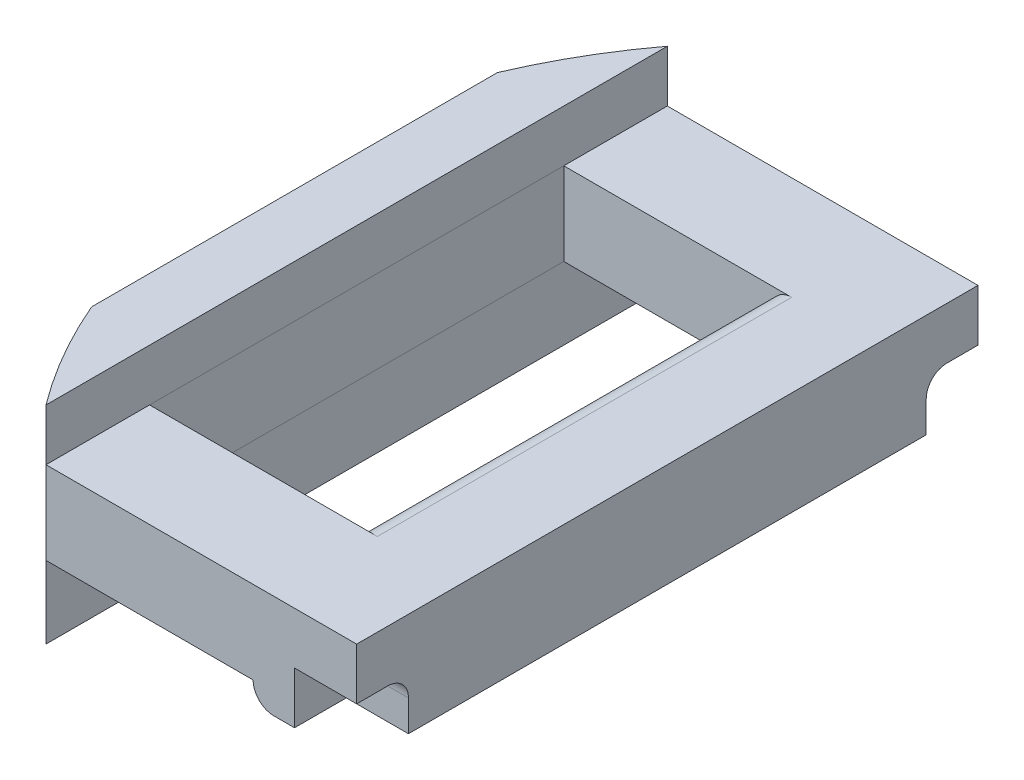
ISO-10303-21;
HEADER;
FILE_DESCRIPTION(('STEP AP214'),'2;1');
FILE_NAME('part.step','',(''),(''),'','','');
FILE_SCHEMA(('AUTOMOTIVE_DESIGN { 1 0 10303 214 1 1 1 1 }'));
ENDSEC;
DATA;
#1=APPLICATION_CONTEXT('core data for automotive mechanical design processes');
#2=APPLICATION_PROTOCOL_DEFINITION('international standard','automotive_design',2000,#1);
#3=PRODUCT_CONTEXT('',#1,'mechanical');
#4=PRODUCT('Part','Part','',(#3));
#5=PRODUCT_RELATED_PRODUCT_CATEGORY('part','',(#4));
#6=PRODUCT_DEFINITION_FORMATION('','',#4);
#7=PRODUCT_DEFINITION_CONTEXT('part definition',#1,'design');
#8=PRODUCT_DEFINITION('design','',#6,#7);
#9=PRODUCT_DEFINITION_SHAPE('','',#8);
#10=(LENGTH_UNIT() NAMED_UNIT(*) SI_UNIT(.MILLI.,.METRE.));
#11=(NAMED_UNIT(*) PLANE_ANGLE_UNIT() SI_UNIT($,.RADIAN.));
#12=(NAMED_UNIT(*) SI_UNIT($,.STERADIAN.) SOLID_ANGLE_UNIT());
#13=UNCERTAINTY_MEASURE_WITH_UNIT(LENGTH_MEASURE(1.E-05),#10,'distance_accuracy_value','');
#14=(GEOMETRIC_REPRESENTATION_CONTEXT(3) GLOBAL_UNCERTAINTY_ASSIGNED_CONTEXT((#13)) GLOBAL_UNIT_ASSIGNED_CONTEXT((#10,
#11,#12)) REPRESENTATION_CONTEXT('',''));
#15=CARTESIAN_POINT('',(0.,0.,0.));
#16=DIRECTION('',(0.,0.,1.));
#17=DIRECTION('',(1.,0.,0.));
#18=AXIS2_PLACEMENT_3D('',#15,#16,#17);
#19=CARTESIAN_POINT('',(10.,0.,15.));
#20=DIRECTION('',(1.,0.,0.));
#21=DIRECTION('',(0.,1.,0.));
#22=AXIS2_PLACEMENT_3D('',#19,#20,#21);
#23=PLANE('',#22);
#24=DIRECTION('',(0.,0.,-1.));
#25=VECTOR('',#24,1.);
#26=CARTESIAN_POINT('',(10.,2.5,1.25));
#27=LINE('',#26,#25);
#28=CARTESIAN_POINT('',(10.,2.5,-13.5));
#29=VERTEX_POINT('',#28);
#30=CARTESIAN_POINT('',(10.,2.5,-15.));
#31=VERTEX_POINT('',#30);
#32=EDGE_CURVE('E230',#29,#31,#27,.T.);
#33=ORIENTED_EDGE('',*,*,#32,.T.);
#34=DIRECTION('',(0.,1.,0.));
#35=VECTOR('',#34,1.);
#36=CARTESIAN_POINT('',(10.,0.,-15.));
#37=LINE('',#36,#35);
#38=CARTESIAN_POINT('',(10.,5.,-15.));
#39=VERTEX_POINT('',#38);
#40=EDGE_CURVE('E368',#31,#39,#37,.T.);
#41=ORIENTED_EDGE('',*,*,#40,.T.);
#42=DIRECTION('',(0.,0.,-1.));
#43=VECTOR('',#42,1.);
#44=CARTESIAN_POINT('',(10.,5.,15.));
#45=LINE('',#44,#43);
#46=CARTESIAN_POINT('',(10.,5.,15.));
#47=VERTEX_POINT('',#46);
#48=EDGE_CURVE('E266',#47,#39,#45,.T.);
#49=ORIENTED_EDGE('',*,*,#48,.F.);
#50=DIRECTION('',(0.,1.,0.));
#51=VECTOR('',#50,1.);
#52=CARTESIAN_POINT('',(10.,0.,15.));
#53=LINE('',#52,#51);
#54=CARTESIAN_POINT('',(10.,2.5,15.));
#55=VERTEX_POINT('',#54);
#56=EDGE_CURVE('E11',#55,#47,#53,.T.);
#57=ORIENTED_EDGE('',*,*,#56,.F.);
#58=DIRECTION('',(0.,0.,-1.));
#59=VECTOR('',#58,1.);
#60=CARTESIAN_POINT('',(10.,2.5,15.));
#61=LINE('',#60,#59);
#62=CARTESIAN_POINT('',(10.,2.5,13.5));
#63=VERTEX_POINT('',#62);
#64=EDGE_CURVE('E193',#55,#63,#61,.T.);
#65=ORIENTED_EDGE('',*,*,#64,.T.);
#66=CARTESIAN_POINT('',(10.,1.5,13.5));
#67=DIRECTION('',(1.,0.,0.));
#68=DIRECTION('',(0.,0.707106781186547,-0.707106781186548));
#69=AXIS2_PLACEMENT_3D('',#66,#67,#68);
#70=CIRCLE('',#69,1.);
#71=CARTESIAN_POINT('',(10.,1.5,12.5));
#72=VERTEX_POINT('',#71);
#73=EDGE_CURVE('E219',#72,#63,#70,.T.);
#74=ORIENTED_EDGE('',*,*,#73,.F.);
#75=DIRECTION('',(0.,-1.,0.));
#76=VECTOR('',#75,1.);
#77=CARTESIAN_POINT('',(10.,1.25,12.5));
#78=LINE('',#77,#76);
#79=CARTESIAN_POINT('',(10.,0.,12.5));
#80=VERTEX_POINT('',#79);
#81=EDGE_CURVE('E30',#72,#80,#78,.T.);
#82=ORIENTED_EDGE('',*,*,#81,.T.);
#83=DIRECTION('',(0.,0.,-1.));
#84=VECTOR('',#83,1.);
#85=CARTESIAN_POINT('',(10.,0.,15.));
#86=LINE('',#85,#84);
#87=CARTESIAN_POINT('',(10.,0.,-12.5));
#88=VERTEX_POINT('',#87);
#89=EDGE_CURVE('E393',#80,#88,#86,.T.);
#90=ORIENTED_EDGE('',*,*,#89,.T.);
#91=DIRECTION('',(0.,1.,0.));
#92=VECTOR('',#91,1.);
#93=CARTESIAN_POINT('',(10.,0.,-12.5));
#94=LINE('',#93,#92);
#95=CARTESIAN_POINT('',(10.,1.5,-12.5));
#96=VERTEX_POINT('',#95);
#97=EDGE_CURVE('E238',#88,#96,#94,.T.);
#98=ORIENTED_EDGE('',*,*,#97,.T.);
#99=CARTESIAN_POINT('',(10.,1.5,-13.5));
#100=DIRECTION('',(1.,0.,0.));
#101=DIRECTION('',(0.,0.707106781186547,0.707106781186548));
#102=AXIS2_PLACEMENT_3D('',#99,#100,#101);
#103=CIRCLE('',#102,1.);
#104=EDGE_CURVE('E237',#29,#96,#103,.T.);
#105=ORIENTED_EDGE('',*,*,#104,.F.);
#106=EDGE_LOOP('',(#33,#41,#49,#57,#65,#74,#82,#90,#98,#105));
#107=FACE_BOUND('',#106,.T.);
#108=ADVANCED_FACE('F16',(#107),#23,.T.);
#109=CARTESIAN_POINT('',(-10.,0.,15.));
#110=DIRECTION('',(0.,0.,1.));
#111=DIRECTION('',(1.,0.,0.));
#112=AXIS2_PLACEMENT_3D('',#109,#110,#111);
#113=PLANE('',#112);
#114=CARTESIAN_POINT('',(6.,1.,15.));
#115=DIRECTION('',(0.,0.,-1.));
#116=DIRECTION('',(-0.707106781186547,-0.707106781186548,0.));
#117=AXIS2_PLACEMENT_3D('',#114,#115,#116);
#118=CIRCLE('',#117,1.);
#119=CARTESIAN_POINT('',(6.,0.,15.));
#120=VERTEX_POINT('',#119);
#121=CARTESIAN_POINT('',(5.,1.,15.));
#122=VERTEX_POINT('',#121);
#123=EDGE_CURVE('E333',#120,#122,#118,.T.);
#124=ORIENTED_EDGE('',*,*,#123,.F.);
#125=DIRECTION('',(1.,0.,0.));
#126=VECTOR('',#125,1.);
#127=CARTESIAN_POINT('',(-10.,0.,15.));
#128=LINE('',#127,#126);
#129=CARTESIAN_POINT('',(7.,0.,15.));
#130=VERTEX_POINT('',#129);
#131=EDGE_CURVE('E203',#120,#130,#128,.T.);
#132=ORIENTED_EDGE('',*,*,#131,.T.);
#133=DIRECTION('',(0.,1.,0.));
#134=VECTOR('',#133,1.);
#135=CARTESIAN_POINT('',(7.,0.625,15.));
#136=LINE('',#135,#134);
#137=CARTESIAN_POINT('',(7.,2.5,15.));
#138=VERTEX_POINT('',#137);
#139=EDGE_CURVE('E196',#130,#138,#136,.T.);
#140=ORIENTED_EDGE('',*,*,#139,.T.);
#141=DIRECTION('',(1.,0.,0.));
#142=VECTOR('',#141,1.);
#143=CARTESIAN_POINT('',(0.,2.5,15.));
#144=LINE('',#143,#142);
#145=EDGE_CURVE('E186',#138,#55,#144,.T.);
#146=ORIENTED_EDGE('',*,*,#145,.T.);
#147=ORIENTED_EDGE('',*,*,#56,.T.);
#148=DIRECTION('',(1.,0.,0.));
#149=VECTOR('',#148,1.);
#150=CARTESIAN_POINT('',(-10.,5.,15.));
#151=LINE('',#150,#149);
#152=CARTESIAN_POINT('',(-5.00000024214387,5.,15.));
#153=VERTEX_POINT('',#152);
#154=EDGE_CURVE('E265',#153,#47,#151,.T.);
#155=ORIENTED_EDGE('',*,*,#154,.F.);
#156=DIRECTION('',(0.,-1.,0.));
#157=VECTOR('',#156,1.);
#158=CARTESIAN_POINT('',(-5.00000024214387,1.,15.));
#159=LINE('',#158,#157);
#160=CARTESIAN_POINT('',(-5.00000007450581,1.,15.0000002235174));
#161=VERTEX_POINT('',#160);
#162=EDGE_CURVE('E295',#153,#161,#159,.T.);
#163=ORIENTED_EDGE('',*,*,#162,.T.);
#164=DIRECTION('',(1.,0.,0.));
#165=VECTOR('',#164,1.);
#166=CARTESIAN_POINT('',(-6.25,1.,15.));
#167=LINE('',#166,#165);
#168=EDGE_CURVE('E162',#161,#122,#167,.T.);
#169=ORIENTED_EDGE('',*,*,#168,.T.);
#170=EDGE_LOOP('',(#124,#132,#140,#146,#147,#155,#163,#169));
#171=FACE_BOUND('',#170,.T.);
#172=ADVANCED_FACE('F199',(#171),#113,.T.);
#173=CARTESIAN_POINT('',(10.,2.5,12.5));
#174=DIRECTION('',(0.,0.,-1.));
#175=DIRECTION('',(0.,-1.,0.));
#176=AXIS2_PLACEMENT_3D('',#173,#174,#175);
#177=PLANE('',#176);
#178=DIRECTION('',(1.,0.,0.));
#179=VECTOR('',#178,1.);
#180=CARTESIAN_POINT('',(10.,1.5,12.5));
#181=LINE('',#180,#179);
#182=CARTESIAN_POINT('',(7.,1.5,12.5));
#183=VERTEX_POINT('',#182);
#184=EDGE_CURVE('E269',#183,#72,#181,.T.);
#185=ORIENTED_EDGE('',*,*,#184,.F.);
#186=DIRECTION('',(0.,-1.,0.));
#187=VECTOR('',#186,1.);
#188=CARTESIAN_POINT('',(7.,2.5,12.5));
#189=LINE('',#188,#187);
#190=CARTESIAN_POINT('',(7.,0.,12.5));
#191=VERTEX_POINT('',#190);
#192=EDGE_CURVE('E206',#183,#191,#189,.T.);
#193=ORIENTED_EDGE('',*,*,#192,.T.);
#194=DIRECTION('',(-1.,0.,0.));
#195=VECTOR('',#194,1.);
#196=CARTESIAN_POINT('',(5.,0.,12.5));
#197=LINE('',#196,#195);
#198=EDGE_CURVE('E345',#80,#191,#197,.T.);
#199=ORIENTED_EDGE('',*,*,#198,.F.);
#200=ORIENTED_EDGE('',*,*,#81,.F.);
#201=EDGE_LOOP('',(#185,#193,#199,#200));
#202=FACE_BOUND('',#201,.T.);
#203=ADVANCED_FACE('F610',(#202),#177,.F.);
#204=CARTESIAN_POINT('',(7.,1.25,-13.75));
#205=DIRECTION('',(-1.,0.,0.));
#206=DIRECTION('',(0.,0.,1.));
#207=AXIS2_PLACEMENT_3D('',#204,#205,#206);
#208=PLANE('',#207);
#209=CARTESIAN_POINT('',(7.,1.5,-13.5));
#210=DIRECTION('',(1.,0.,0.));
#211=DIRECTION('',(0.,0.707106781186547,0.707106781186548));
#212=AXIS2_PLACEMENT_3D('',#209,#210,#211);
#213=CIRCLE('',#212,1.);
#214=CARTESIAN_POINT('',(7.,2.5,-13.5));
#215=VERTEX_POINT('',#214);
#216=CARTESIAN_POINT('',(7.,1.5,-12.5));
#217=VERTEX_POINT('',#216);
#218=EDGE_CURVE('E350',#215,#217,#213,.T.);
#219=ORIENTED_EDGE('',*,*,#218,.T.);
#220=DIRECTION('',(0.,1.,0.));
#221=VECTOR('',#220,1.);
#222=CARTESIAN_POINT('',(7.,2.5,-12.5));
#223=LINE('',#222,#221);
#224=CARTESIAN_POINT('',(7.,0.,-12.5));
#225=VERTEX_POINT('',#224);
#226=EDGE_CURVE('E359',#225,#217,#223,.T.);
#227=ORIENTED_EDGE('',*,*,#226,.F.);
#228=DIRECTION('',(0.,0.,1.));
#229=VECTOR('',#228,1.);
#230=CARTESIAN_POINT('',(7.,0.,-6.875));
#231=LINE('',#230,#229);
#232=CARTESIAN_POINT('',(7.,0.,-15.));
#233=VERTEX_POINT('',#232);
#234=EDGE_CURVE('E388',#233,#225,#231,.T.);
#235=ORIENTED_EDGE('',*,*,#234,.F.);
#236=DIRECTION('',(0.,-1.,0.));
#237=VECTOR('',#236,1.);
#238=CARTESIAN_POINT('',(7.,0.625,-15.));
#239=LINE('',#238,#237);
#240=CARTESIAN_POINT('',(7.,2.5,-15.));
#241=VERTEX_POINT('',#240);
#242=EDGE_CURVE('E271',#241,#233,#239,.T.);
#243=ORIENTED_EDGE('',*,*,#242,.F.);
#244=DIRECTION('',(0.,0.,-1.));
#245=VECTOR('',#244,1.);
#246=CARTESIAN_POINT('',(7.,2.5,-15.));
#247=LINE('',#246,#245);
#248=EDGE_CURVE('E233',#215,#241,#247,.T.);
#249=ORIENTED_EDGE('',*,*,#248,.F.);
#250=EDGE_LOOP('',(#219,#227,#235,#243,#249));
#251=FACE_BOUND('',#250,.T.);
#252=ADVANCED_FACE('F600',(#251),#208,.F.);
#253=CARTESIAN_POINT('',(10.,2.5,-12.5));
#254=DIRECTION('',(0.,1.,0.));
#255=DIRECTION('',(1.,0.,0.));
#256=AXIS2_PLACEMENT_3D('',#253,#254,#255);
#257=PLANE('',#256);
#258=DIRECTION('',(1.,0.,0.));
#259=VECTOR('',#258,1.);
#260=CARTESIAN_POINT('',(10.,2.5,-13.5));
#261=LINE('',#260,#259);
#262=EDGE_CURVE('E253',#215,#29,#261,.T.);
#263=ORIENTED_EDGE('',*,*,#262,.F.);
#264=ORIENTED_EDGE('',*,*,#248,.T.);
#265=DIRECTION('',(-1.,0.,0.));
#266=VECTOR('',#265,1.);
#267=CARTESIAN_POINT('',(10.,2.5,-15.));
#268=LINE('',#267,#266);
#269=EDGE_CURVE('E283',#31,#241,#268,.T.);
#270=ORIENTED_EDGE('',*,*,#269,.F.);
#271=ORIENTED_EDGE('',*,*,#32,.F.);
#272=EDGE_LOOP('',(#263,#264,#270,#271));
#273=FACE_BOUND('',#272,.T.);
#274=ADVANCED_FACE('F595',(#273),#257,.F.);
#275=CARTESIAN_POINT('',(-10.,0.,-10.));
#276=DIRECTION('',(0.,0.,1.));
#277=DIRECTION('',(1.,0.,0.));
#278=AXIS2_PLACEMENT_3D('',#275,#276,#277);
#279=PLANE('',#278);
#280=DIRECTION('',(0.,-1.,0.));
#281=VECTOR('',#280,1.);
#282=CARTESIAN_POINT('',(-4.99999982615312,0.5,-10.));
#283=LINE('',#282,#281);
#284=CARTESIAN_POINT('',(-4.99999982615312,5.,-10.));
#285=VERTEX_POINT('',#284);
#286=CARTESIAN_POINT('',(-4.99999982615312,1.,-10.));
#287=VERTEX_POINT('',#286);
#288=EDGE_CURVE('E320',#285,#287,#283,.T.);
#289=ORIENTED_EDGE('',*,*,#288,.T.);
#290=DIRECTION('',(1.,0.,0.));
#291=VECTOR('',#290,1.);
#292=CARTESIAN_POINT('',(-6.25,1.,-10.));
#293=LINE('',#292,#291);
#294=CARTESIAN_POINT('',(5.,1.,-10.));
#295=VERTEX_POINT('',#294);
#296=EDGE_CURVE('E311',#287,#295,#293,.T.);
#297=ORIENTED_EDGE('',*,*,#296,.T.);
#298=DIRECTION('',(0.,1.,0.));
#299=VECTOR('',#298,1.);
#300=CARTESIAN_POINT('',(5.,0.,-10.));
#301=LINE('',#300,#299);
#302=CARTESIAN_POINT('',(5.,4.,-10.));
#303=VERTEX_POINT('',#302);
#304=EDGE_CURVE('E228',#295,#303,#301,.T.);
#305=ORIENTED_EDGE('',*,*,#304,.T.);
#306=CARTESIAN_POINT('',(6.,4.,-10.));
#307=DIRECTION('',(0.,0.,1.));
#308=DIRECTION('',(-0.707106781186547,0.707106781186548,0.));
#309=AXIS2_PLACEMENT_3D('',#306,#307,#308);
#310=CIRCLE('',#309,1.);
#311=CARTESIAN_POINT('',(6.,5.,-10.));
#312=VERTEX_POINT('',#311);
#313=EDGE_CURVE('E323',#312,#303,#310,.T.);
#314=ORIENTED_EDGE('',*,*,#313,.F.);
#315=DIRECTION('',(1.,0.,0.));
#316=VECTOR('',#315,1.);
#317=CARTESIAN_POINT('',(5.,5.,-10.));
#318=LINE('',#317,#316);
#319=EDGE_CURVE('E254',#285,#312,#318,.T.);
#320=ORIENTED_EDGE('',*,*,#319,.F.);
#321=EDGE_LOOP('',(#289,#297,#305,#314,#320));
#322=FACE_BOUND('',#321,.T.);
#323=ADVANCED_FACE('F495',(#322),#279,.T.);
#324=CARTESIAN_POINT('',(5.,0.,10.));
#325=DIRECTION('',(0.,0.,-1.));
#326=DIRECTION('',(0.,-1.,0.));
#327=AXIS2_PLACEMENT_3D('',#324,#325,#326);
#328=PLANE('',#327);
#329=DIRECTION('',(0.,1.,0.));
#330=VECTOR('',#329,1.);
#331=CARTESIAN_POINT('',(-5.00000002483527,0.5,10.));
#332=LINE('',#331,#330);
#333=CARTESIAN_POINT('',(-5.00000007450581,1.,10.0000001490116));
#334=VERTEX_POINT('',#333);
#335=CARTESIAN_POINT('',(-5.00000007450581,5.,10.0000001490116));
#336=VERTEX_POINT('',#335);
#337=EDGE_CURVE('E41',#334,#336,#332,.T.);
#338=ORIENTED_EDGE('',*,*,#337,.T.);
#339=DIRECTION('',(-1.,0.,0.));
#340=VECTOR('',#339,1.);
#341=CARTESIAN_POINT('',(-10.,5.,10.));
#342=LINE('',#341,#340);
#343=CARTESIAN_POINT('',(6.,5.,10.));
#344=VERTEX_POINT('',#343);
#345=EDGE_CURVE('E270',#344,#336,#342,.T.);
#346=ORIENTED_EDGE('',*,*,#345,.F.);
#347=CARTESIAN_POINT('',(6.,4.,10.));
#348=DIRECTION('',(0.,0.,-1.));
#349=DIRECTION('',(-0.707106781186547,0.707106781186548,0.));
#350=AXIS2_PLACEMENT_3D('',#347,#348,#349);
#351=CIRCLE('',#350,1.);
#352=CARTESIAN_POINT('',(5.,4.,10.));
#353=VERTEX_POINT('',#352);
#354=EDGE_CURVE('E307',#353,#344,#351,.T.);
#355=ORIENTED_EDGE('',*,*,#354,.F.);
#356=DIRECTION('',(0.,1.,0.));
#357=VECTOR('',#356,1.);
#358=CARTESIAN_POINT('',(5.,0.,10.));
#359=LINE('',#358,#357);
#360=CARTESIAN_POINT('',(5.,1.,10.));
#361=VERTEX_POINT('',#360);
#362=EDGE_CURVE('E229',#361,#353,#359,.T.);
#363=ORIENTED_EDGE('',*,*,#362,.F.);
#364=DIRECTION('',(-1.,0.,0.));
#365=VECTOR('',#364,1.);
#366=CARTESIAN_POINT('',(1.25,1.,10.));
#367=LINE('',#366,#365);
#368=EDGE_CURVE('E396',#361,#334,#367,.T.);
#369=ORIENTED_EDGE('',*,*,#368,.T.);
#370=EDGE_LOOP('',(#338,#346,#355,#363,#369));
#371=FACE_BOUND('',#370,.T.);
#372=ADVANCED_FACE('F579',(#371),#328,.T.);
#373=CARTESIAN_POINT('',(15.0000002235174,1.,0.));
#374=DIRECTION('',(0.,1.,0.));
#375=DIRECTION('',(-0.8,0.,0.6));
#376=AXIS2_PLACEMENT_3D('',#373,#374,#375);
#377=CYLINDRICAL_SURFACE('',#376,25.000000372529);
#378=DIRECTION('',(0.,1.,0.));
#379=VECTOR('',#378,1.);
#380=CARTESIAN_POINT('',(-7.9999998882413,1.,-9.79795965931432));
#381=LINE('',#380,#379);
#382=CARTESIAN_POINT('',(-7.9999998882413,-2.5,-9.79795965931434));
#383=VERTEX_POINT('',#382);
#384=CARTESIAN_POINT('',(-7.99999988824129,7.5,-9.79795965931434));
#385=VERTEX_POINT('',#384);
#386=EDGE_CURVE('E252',#383,#385,#381,.T.);
#387=ORIENTED_EDGE('',*,*,#386,.T.);
#388=CARTESIAN_POINT('',(15.0000002235174,7.5,0.));
#389=DIRECTION('',(0.,1.,0.));
#390=DIRECTION('',(-0.8,0.,-0.6));
#391=AXIS2_PLACEMENT_3D('',#388,#389,#390);
#392=CIRCLE('',#391,25.000000372529);
#393=CARTESIAN_POINT('',(-5.00000007450581,7.5,-15.0000002235174));
#394=VERTEX_POINT('',#393);
#395=EDGE_CURVE('E285',#394,#385,#392,.T.);
#396=ORIENTED_EDGE('',*,*,#395,.F.);
#397=DIRECTION('',(0.,1.,0.));
#398=VECTOR('',#397,1.);
#399=CARTESIAN_POINT('',(-5.00000007450581,5.,-15.0000002235174));
#400=LINE('',#399,#398);
#401=CARTESIAN_POINT('',(-5.00000007450581,5.,-15.0000002235174));
#402=VERTEX_POINT('',#401);
#403=EDGE_CURVE('E387',#402,#394,#400,.T.);
#404=ORIENTED_EDGE('',*,*,#403,.F.);
#405=DIRECTION('',(0.,1.,0.));
#406=VECTOR('',#405,1.);
#407=CARTESIAN_POINT('',(-4.99999977648258,1.,-15.));
#408=LINE('',#407,#406);
#409=CARTESIAN_POINT('',(-5.00000007450581,1.,-15.0000002235174));
#410=VERTEX_POINT('',#409);
#411=EDGE_CURVE('E258',#410,#402,#408,.T.);
#412=ORIENTED_EDGE('',*,*,#411,.F.);
#413=DIRECTION('',(0.,-1.,0.));
#414=VECTOR('',#413,1.);
#415=CARTESIAN_POINT('',(-5.00000007450581,0.,-15.0000002235174));
#416=LINE('',#415,#414);
#417=CARTESIAN_POINT('',(-5.00000007450581,-2.5,-15.0000002235174));
#418=VERTEX_POINT('',#417);
#419=EDGE_CURVE('E294',#410,#418,#416,.T.);
#420=ORIENTED_EDGE('',*,*,#419,.T.);
#421=CARTESIAN_POINT('',(15.0000002235174,-2.5,0.));
#422=DIRECTION('',(0.,-1.,0.));
#423=DIRECTION('',(-0.91999999076128,0.,-0.391918380532534));
#424=AXIS2_PLACEMENT_3D('',#421,#422,#423);
#425=CIRCLE('',#424,25.000000372529);
#426=EDGE_CURVE('E301',#383,#418,#425,.T.);
#427=ORIENTED_EDGE('',*,*,#426,.F.);
#428=EDGE_LOOP('',(#387,#396,#404,#412,#420,#427));
#429=FACE_BOUND('',#428,.T.);
#430=ADVANCED_FACE('F584',(#429),#377,.T.);
#431=CARTESIAN_POINT('',(-5.00000002483527,1.,10.0000001490116));
#432=DIRECTION('',(1.,0.,9.93410749217105E-09));
#433=DIRECTION('',(0.,-1.,0.));
#434=AXIS2_PLACEMENT_3D('',#431,#432,#433);
#435=PLANE('',#434);
#436=DIRECTION('',(9.93410749217105E-09,0.,-1.));
#437=VECTOR('',#436,1.);
#438=CARTESIAN_POINT('',(-5.00000007450581,1.,15.0000002235174));
#439=LINE('',#438,#437);
#440=EDGE_CURVE('E277',#334,#287,#439,.T.);
#441=ORIENTED_EDGE('',*,*,#440,.T.);
#442=ORIENTED_EDGE('',*,*,#288,.F.);
#443=DIRECTION('',(9.93410749217105E-09,0.,-1.));
#444=VECTOR('',#443,1.);
#445=CARTESIAN_POINT('',(-5.00000007450581,5.,15.0000002235174));
#446=LINE('',#445,#444);
#447=EDGE_CURVE('E243',#336,#285,#446,.T.);
#448=ORIENTED_EDGE('',*,*,#447,.F.);
#449=ORIENTED_EDGE('',*,*,#337,.F.);
#450=EDGE_LOOP('',(#441,#442,#448,#449));
#451=FACE_BOUND('',#450,.T.);
#452=ADVANCED_FACE('F655',(#451),#435,.T.);
#453=CARTESIAN_POINT('',(-2.5,1.,12.5));
#454=DIRECTION('',(0.,1.,0.));
#455=DIRECTION('',(1.,0.,0.));
#456=AXIS2_PLACEMENT_3D('',#453,#454,#455);
#457=PLANE('',#456);
#458=DIRECTION('',(0.,0.,-1.));
#459=VECTOR('',#458,1.);
#460=CARTESIAN_POINT('',(-5.00000007450581,1.,13.7500001117587));
#461=LINE('',#460,#459);
#462=EDGE_CURVE('E278',#287,#410,#461,.T.);
#463=ORIENTED_EDGE('',*,*,#462,.T.);
#464=DIRECTION('',(-1.,0.,0.));
#465=VECTOR('',#464,1.);
#466=CARTESIAN_POINT('',(3.75,1.,-15.));
#467=LINE('',#466,#465);
#468=CARTESIAN_POINT('',(5.,1.,-15.));
#469=VERTEX_POINT('',#468);
#470=EDGE_CURVE('E261',#469,#410,#467,.T.);
#471=ORIENTED_EDGE('',*,*,#470,.F.);
#472=DIRECTION('',(0.,0.,-1.));
#473=VECTOR('',#472,1.);
#474=CARTESIAN_POINT('',(5.,1.,-10.));
#475=LINE('',#474,#473);
#476=EDGE_CURVE('E331',#295,#469,#475,.T.);
#477=ORIENTED_EDGE('',*,*,#476,.F.);
#478=ORIENTED_EDGE('',*,*,#296,.F.);
#479=EDGE_LOOP('',(#463,#471,#477,#478));
#480=FACE_BOUND('',#479,.T.);
#481=ADVANCED_FACE('F660',(#480),#457,.F.);
#482=CARTESIAN_POINT('',(-2.5,1.,12.5));
#483=DIRECTION('',(0.,1.,0.));
#484=DIRECTION('',(1.,0.,0.));
#485=AXIS2_PLACEMENT_3D('',#482,#483,#484);
#486=PLANE('',#485);
#487=DIRECTION('',(0.,0.,-1.));
#488=VECTOR('',#487,1.);
#489=CARTESIAN_POINT('',(-5.00000007450581,1.,13.7500001117587));
#490=LINE('',#489,#488);
#491=EDGE_CURVE('E276',#161,#334,#490,.T.);
#492=ORIENTED_EDGE('',*,*,#491,.T.);
#493=ORIENTED_EDGE('',*,*,#368,.F.);
#494=DIRECTION('',(0.,0.,-1.));
#495=VECTOR('',#494,1.);
#496=CARTESIAN_POINT('',(5.,1.,15.));
#497=LINE('',#496,#495);
#498=EDGE_CURVE('E329',#122,#361,#497,.T.);
#499=ORIENTED_EDGE('',*,*,#498,.F.);
#500=ORIENTED_EDGE('',*,*,#168,.F.);
#501=EDGE_LOOP('',(#492,#493,#499,#500));
#502=FACE_BOUND('',#501,.T.);
#503=ADVANCED_FACE('F730',(#502),#486,.F.);
#504=CARTESIAN_POINT('',(-5.00000007450581,0.,15.0000002235174));
#505=DIRECTION('',(1.,0.,0.));
#506=DIRECTION('',(0.,1.,0.));
#507=AXIS2_PLACEMENT_3D('',#504,#505,#506);
#508=PLANE('',#507);
#509=ORIENTED_EDGE('',*,*,#419,.F.);
#510=ORIENTED_EDGE('',*,*,#462,.F.);
#511=ORIENTED_EDGE('',*,*,#440,.F.);
#512=ORIENTED_EDGE('',*,*,#491,.F.);
#513=DIRECTION('',(0.,1.,0.));
#514=VECTOR('',#513,1.);
#515=CARTESIAN_POINT('',(-5.00000007450581,0.,15.0000002235174));
#516=LINE('',#515,#514);
#517=CARTESIAN_POINT('',(-5.00000007450581,-2.5,15.0000002235174));
#518=VERTEX_POINT('',#517);
#519=EDGE_CURVE('E20',#518,#161,#516,.T.);
#520=ORIENTED_EDGE('',*,*,#519,.F.);
#521=DIRECTION('',(0.,0.,1.));
#522=VECTOR('',#521,1.);
#523=CARTESIAN_POINT('',(-5.00000007450581,-2.5,-15.0000002235174));
#524=LINE('',#523,#522);
#525=EDGE_CURVE('E304',#418,#518,#524,.T.);
#526=ORIENTED_EDGE('',*,*,#525,.F.);
#527=EDGE_LOOP('',(#509,#510,#511,#512,#520,#526));
#528=FACE_BOUND('',#527,.T.);
#529=ADVANCED_FACE('F18',(#528),#508,.T.);
#530=CARTESIAN_POINT('',(15.0000002235174,1.,0.));
#531=DIRECTION('',(0.,1.,0.));
#532=DIRECTION('',(-0.8,0.,0.6));
#533=AXIS2_PLACEMENT_3D('',#530,#531,#532);
#534=CYLINDRICAL_SURFACE('',#533,25.000000372529);
#535=DIRECTION('',(0.,-1.,0.));
#536=VECTOR('',#535,1.);
#537=CARTESIAN_POINT('',(-7.99999988824129,1.,9.79795965931433));
#538=LINE('',#537,#536);
#539=CARTESIAN_POINT('',(-7.99999988824129,7.5,9.79795965931435));
#540=VERTEX_POINT('',#539);
#541=CARTESIAN_POINT('',(-7.99999988824129,-2.5,9.79795965931434));
#542=VERTEX_POINT('',#541);
#543=EDGE_CURVE('E194',#540,#542,#538,.T.);
#544=ORIENTED_EDGE('',*,*,#543,.T.);
#545=CARTESIAN_POINT('',(15.0000002235174,-2.5,0.));
#546=DIRECTION('',(0.,-1.,0.));
#547=DIRECTION('',(-0.8,0.,0.6));
#548=AXIS2_PLACEMENT_3D('',#545,#546,#547);
#549=CIRCLE('',#548,25.000000372529);
#550=EDGE_CURVE('E374',#518,#542,#549,.T.);
#551=ORIENTED_EDGE('',*,*,#550,.F.);
#552=ORIENTED_EDGE('',*,*,#519,.T.);
#553=ORIENTED_EDGE('',*,*,#162,.F.);
#554=DIRECTION('',(0.,1.,0.));
#555=VECTOR('',#554,1.);
#556=CARTESIAN_POINT('',(-5.00000024214387,5.,15.));
#557=LINE('',#556,#555);
#558=CARTESIAN_POINT('',(-5.00000024214387,7.5,15.));
#559=VERTEX_POINT('',#558);
#560=EDGE_CURVE('E289',#153,#559,#557,.T.);
#561=ORIENTED_EDGE('',*,*,#560,.T.);
#562=CARTESIAN_POINT('',(15.0000002235174,7.5,0.));
#563=DIRECTION('',(0.,1.,0.));
#564=DIRECTION('',(-0.91999999076128,0.,0.391918380532535));
#565=AXIS2_PLACEMENT_3D('',#562,#563,#564);
#566=CIRCLE('',#565,25.000000372529);
#567=EDGE_CURVE('E377',#540,#559,#566,.T.);
#568=ORIENTED_EDGE('',*,*,#567,.F.);
#569=EDGE_LOOP('',(#544,#551,#552,#553,#561,#568));
#570=FACE_BOUND('',#569,.T.);
#571=ADVANCED_FACE('F431',(#570),#534,.T.);
#572=CARTESIAN_POINT('',(0.,5.,0.));
#573=DIRECTION('',(0.,1.,0.));
#574=DIRECTION('',(1.,0.,0.));
#575=AXIS2_PLACEMENT_3D('',#572,#573,#574);
#576=PLANE('',#575);
#577=DIRECTION('',(-5.58793533204464E-09,0.,1.));
#578=VECTOR('',#577,1.);
#579=CARTESIAN_POINT('',(-5.00000020023435,5.,7.49999998603016));
#580=LINE('',#579,#578);
#581=EDGE_CURVE('E274',#402,#285,#580,.T.);
#582=ORIENTED_EDGE('',*,*,#581,.T.);
#583=ORIENTED_EDGE('',*,*,#319,.T.);
#584=DIRECTION('',(0.,0.,-1.));
#585=VECTOR('',#584,1.);
#586=CARTESIAN_POINT('',(6.,5.,-5.));
#587=LINE('',#586,#585);
#588=EDGE_CURVE('E313',#344,#312,#587,.T.);
#589=ORIENTED_EDGE('',*,*,#588,.F.);
#590=ORIENTED_EDGE('',*,*,#345,.T.);
#591=DIRECTION('',(-5.58793533204464E-09,0.,1.));
#592=VECTOR('',#591,1.);
#593=CARTESIAN_POINT('',(-5.00000020023435,5.,7.49999998603016));
#594=LINE('',#593,#592);
#595=EDGE_CURVE('E239',#336,#153,#594,.T.);
#596=ORIENTED_EDGE('',*,*,#595,.T.);
#597=ORIENTED_EDGE('',*,*,#154,.T.);
#598=ORIENTED_EDGE('',*,*,#48,.T.);
#599=DIRECTION('',(-1.,0.,0.));
#600=VECTOR('',#599,1.);
#601=CARTESIAN_POINT('',(10.,5.,-15.));
#602=LINE('',#601,#600);
#603=EDGE_CURVE('E257',#39,#402,#602,.T.);
#604=ORIENTED_EDGE('',*,*,#603,.T.);
#605=EDGE_LOOP('',(#582,#583,#589,#590,#596,#597,#598,#604));
#606=FACE_BOUND('',#605,.T.);
#607=ADVANCED_FACE('F628',(#606),#576,.T.);
#608=CARTESIAN_POINT('',(-7.99999988824129,0.,9.79795965931434));
#609=DIRECTION('',(1.,0.,0.));
#610=DIRECTION('',(0.,0.,-1.));
#611=AXIS2_PLACEMENT_3D('',#608,#609,#610);
#612=PLANE('',#611);
#613=ORIENTED_EDGE('',*,*,#543,.F.);
#614=DIRECTION('',(0.,0.,1.));
#615=VECTOR('',#614,1.);
#616=CARTESIAN_POINT('',(-7.9999998882413,7.5,-9.79795965931434));
#617=LINE('',#616,#615);
#618=EDGE_CURVE('E287',#385,#540,#617,.T.);
#619=ORIENTED_EDGE('',*,*,#618,.F.);
#620=ORIENTED_EDGE('',*,*,#386,.F.);
#621=DIRECTION('',(0.,0.,-1.));
#622=VECTOR('',#621,1.);
#623=CARTESIAN_POINT('',(-7.99999988824129,-2.5,9.79795965931434));
#624=LINE('',#623,#622);
#625=EDGE_CURVE('E308',#542,#383,#624,.T.);
#626=ORIENTED_EDGE('',*,*,#625,.F.);
#627=EDGE_LOOP('',(#613,#619,#620,#626));
#628=FACE_BOUND('',#627,.T.);
#629=ADVANCED_FACE('F534',(#628),#612,.F.);
#630=CARTESIAN_POINT('',(10.,2.5,15.));
#631=DIRECTION('',(0.,1.,0.));
#632=DIRECTION('',(1.,0.,0.));
#633=AXIS2_PLACEMENT_3D('',#630,#631,#632);
#634=PLANE('',#633);
#635=DIRECTION('',(-1.,0.,0.));
#636=VECTOR('',#635,1.);
#637=CARTESIAN_POINT('',(10.,2.5,13.5));
#638=LINE('',#637,#636);
#639=CARTESIAN_POINT('',(7.,2.5,13.5));
#640=VERTEX_POINT('',#639);
#641=EDGE_CURVE('E212',#63,#640,#638,.T.);
#642=ORIENTED_EDGE('',*,*,#641,.F.);
#643=ORIENTED_EDGE('',*,*,#64,.F.);
#644=ORIENTED_EDGE('',*,*,#145,.F.);
#645=DIRECTION('',(0.,0.,-1.));
#646=VECTOR('',#645,1.);
#647=CARTESIAN_POINT('',(7.,2.5,15.));
#648=LINE('',#647,#646);
#649=EDGE_CURVE('E191',#138,#640,#648,.T.);
#650=ORIENTED_EDGE('',*,*,#649,.T.);
#651=EDGE_LOOP('',(#642,#643,#644,#650));
#652=FACE_BOUND('',#651,.T.);
#653=ADVANCED_FACE('F188',(#652),#634,.F.);
#654=CARTESIAN_POINT('',(7.,1.25,13.75));
#655=DIRECTION('',(-1.,0.,0.));
#656=DIRECTION('',(0.,0.,1.));
#657=AXIS2_PLACEMENT_3D('',#654,#655,#656);
#658=PLANE('',#657);
#659=CARTESIAN_POINT('',(7.,1.5,13.5));
#660=DIRECTION('',(1.,0.,0.));
#661=DIRECTION('',(0.,0.707106781186547,-0.707106781186548));
#662=AXIS2_PLACEMENT_3D('',#659,#660,#661);
#663=CIRCLE('',#662,1.);
#664=EDGE_CURVE('E215',#183,#640,#663,.T.);
#665=ORIENTED_EDGE('',*,*,#664,.T.);
#666=ORIENTED_EDGE('',*,*,#649,.F.);
#667=ORIENTED_EDGE('',*,*,#139,.F.);
#668=DIRECTION('',(0.,0.,1.));
#669=VECTOR('',#668,1.);
#670=CARTESIAN_POINT('',(7.,0.,6.875));
#671=LINE('',#670,#669);
#672=EDGE_CURVE('E338',#191,#130,#671,.T.);
#673=ORIENTED_EDGE('',*,*,#672,.F.);
#674=ORIENTED_EDGE('',*,*,#192,.F.);
#675=EDGE_LOOP('',(#665,#666,#667,#673,#674));
#676=FACE_BOUND('',#675,.T.);
#677=ADVANCED_FACE('F207',(#676),#658,.F.);
#678=CARTESIAN_POINT('',(10.,1.5,13.5));
#679=DIRECTION('',(-1.,0.,0.));
#680=DIRECTION('',(0.,0.707106781186547,-0.707106781186548));
#681=AXIS2_PLACEMENT_3D('',#678,#679,#680);
#682=CYLINDRICAL_SURFACE('',#681,1.);
#683=ORIENTED_EDGE('',*,*,#664,.F.);
#684=ORIENTED_EDGE('',*,*,#184,.T.);
#685=ORIENTED_EDGE('',*,*,#73,.T.);
#686=ORIENTED_EDGE('',*,*,#641,.T.);
#687=EDGE_LOOP('',(#683,#684,#685,#686));
#688=FACE_BOUND('',#687,.T.);
#689=ADVANCED_FACE('F549',(#688),#682,.F.);
#690=CARTESIAN_POINT('',(10.,0.,-15.));
#691=DIRECTION('',(0.,0.,-1.));
#692=DIRECTION('',(0.,-1.,0.));
#693=AXIS2_PLACEMENT_3D('',#690,#691,#692);
#694=PLANE('',#693);
#695=CARTESIAN_POINT('',(6.,1.,-15.));
#696=DIRECTION('',(0.,0.,1.));
#697=DIRECTION('',(-0.707106781186547,-0.707106781186548,0.));
#698=AXIS2_PLACEMENT_3D('',#695,#696,#697);
#699=CIRCLE('',#698,1.);
#700=CARTESIAN_POINT('',(6.,0.,-15.));
#701=VERTEX_POINT('',#700);
#702=EDGE_CURVE('E250',#469,#701,#699,.T.);
#703=ORIENTED_EDGE('',*,*,#702,.F.);
#704=ORIENTED_EDGE('',*,*,#470,.T.);
#705=ORIENTED_EDGE('',*,*,#411,.T.);
#706=ORIENTED_EDGE('',*,*,#603,.F.);
#707=ORIENTED_EDGE('',*,*,#40,.F.);
#708=ORIENTED_EDGE('',*,*,#269,.T.);
#709=ORIENTED_EDGE('',*,*,#242,.T.);
#710=DIRECTION('',(-1.,0.,0.));
#711=VECTOR('',#710,1.);
#712=CARTESIAN_POINT('',(10.,0.,-15.));
#713=LINE('',#712,#711);
#714=EDGE_CURVE('E395',#233,#701,#713,.T.);
#715=ORIENTED_EDGE('',*,*,#714,.T.);
#716=EDGE_LOOP('',(#703,#704,#705,#706,#707,#708,#709,#715));
#717=FACE_BOUND('',#716,.T.);
#718=ADVANCED_FACE('F567',(#717),#694,.T.);
#719=CARTESIAN_POINT('',(0.,0.,0.));
#720=DIRECTION('',(0.,1.,0.));
#721=DIRECTION('',(1.,0.,0.));
#722=AXIS2_PLACEMENT_3D('',#719,#720,#721);
#723=PLANE('',#722);
#724=DIRECTION('',(0.,0.,1.));
#725=VECTOR('',#724,1.);
#726=CARTESIAN_POINT('',(6.,0.,-5.));
#727=LINE('',#726,#725);
#728=EDGE_CURVE('E349',#701,#120,#727,.T.);
#729=ORIENTED_EDGE('',*,*,#728,.F.);
#730=ORIENTED_EDGE('',*,*,#714,.F.);
#731=ORIENTED_EDGE('',*,*,#234,.T.);
#732=DIRECTION('',(1.,0.,0.));
#733=VECTOR('',#732,1.);
#734=CARTESIAN_POINT('',(5.,0.,-12.5));
#735=LINE('',#734,#733);
#736=EDGE_CURVE('E339',#225,#88,#735,.T.);
#737=ORIENTED_EDGE('',*,*,#736,.T.);
#738=ORIENTED_EDGE('',*,*,#89,.F.);
#739=ORIENTED_EDGE('',*,*,#198,.T.);
#740=ORIENTED_EDGE('',*,*,#672,.T.);
#741=ORIENTED_EDGE('',*,*,#131,.F.);
#742=EDGE_LOOP('',(#729,#730,#731,#737,#738,#739,#740,#741));
#743=FACE_BOUND('',#742,.T.);
#744=ADVANCED_FACE('F573',(#743),#723,.F.);
#745=CARTESIAN_POINT('',(6.,1.,-5.));
#746=DIRECTION('',(0.,0.,-1.));
#747=DIRECTION('',(-0.707106781186547,-0.707106781186548,0.));
#748=AXIS2_PLACEMENT_3D('',#745,#746,#747);
#749=CYLINDRICAL_SURFACE('',#748,1.);
#750=ORIENTED_EDGE('',*,*,#702,.T.);
#751=ORIENTED_EDGE('',*,*,#728,.T.);
#752=ORIENTED_EDGE('',*,*,#123,.T.);
#753=ORIENTED_EDGE('',*,*,#498,.T.);
#754=DIRECTION('',(0.,0.,-1.));
#755=VECTOR('',#754,1.);
#756=CARTESIAN_POINT('',(5.,1.,-5.));
#757=LINE('',#756,#755);
#758=EDGE_CURVE('E223',#361,#295,#757,.T.);
#759=ORIENTED_EDGE('',*,*,#758,.T.);
#760=ORIENTED_EDGE('',*,*,#476,.T.);
#761=EDGE_LOOP('',(#750,#751,#752,#753,#759,#760));
#762=FACE_BOUND('',#761,.T.);
#763=ADVANCED_FACE('F565',(#762),#749,.T.);
#764=CARTESIAN_POINT('',(5.,0.,-10.));
#765=DIRECTION('',(-1.,0.,0.));
#766=DIRECTION('',(0.,0.,1.));
#767=AXIS2_PLACEMENT_3D('',#764,#765,#766);
#768=PLANE('',#767);
#769=DIRECTION('',(0.,0.,1.));
#770=VECTOR('',#769,1.);
#771=CARTESIAN_POINT('',(5.,4.,-5.));
#772=LINE('',#771,#770);
#773=EDGE_CURVE('E315',#303,#353,#772,.T.);
#774=ORIENTED_EDGE('',*,*,#773,.F.);
#775=ORIENTED_EDGE('',*,*,#304,.F.);
#776=ORIENTED_EDGE('',*,*,#758,.F.);
#777=ORIENTED_EDGE('',*,*,#362,.T.);
#778=EDGE_LOOP('',(#774,#775,#776,#777));
#779=FACE_BOUND('',#778,.T.);
#780=ADVANCED_FACE('F557',(#779),#768,.T.);
#781=CARTESIAN_POINT('',(6.,4.,-5.));
#782=DIRECTION('',(0.,0.,1.));
#783=DIRECTION('',(-0.707106781186547,0.707106781186548,0.));
#784=AXIS2_PLACEMENT_3D('',#781,#782,#783);
#785=CYLINDRICAL_SURFACE('',#784,1.);
#786=ORIENTED_EDGE('',*,*,#313,.T.);
#787=ORIENTED_EDGE('',*,*,#773,.T.);
#788=ORIENTED_EDGE('',*,*,#354,.T.);
#789=ORIENTED_EDGE('',*,*,#588,.T.);
#790=EDGE_LOOP('',(#786,#787,#788,#789));
#791=FACE_BOUND('',#790,.T.);
#792=ADVANCED_FACE('F486',(#791),#785,.T.);
#793=CARTESIAN_POINT('',(10.,0.,-12.5));
#794=DIRECTION('',(0.,0.,1.));
#795=DIRECTION('',(1.,0.,0.));
#796=AXIS2_PLACEMENT_3D('',#793,#794,#795);
#797=PLANE('',#796);
#798=DIRECTION('',(-1.,0.,0.));
#799=VECTOR('',#798,1.);
#800=CARTESIAN_POINT('',(10.,1.5,-12.5));
#801=LINE('',#800,#799);
#802=EDGE_CURVE('E232',#96,#217,#801,.T.);
#803=ORIENTED_EDGE('',*,*,#802,.F.);
#804=ORIENTED_EDGE('',*,*,#97,.F.);
#805=ORIENTED_EDGE('',*,*,#736,.F.);
#806=ORIENTED_EDGE('',*,*,#226,.T.);
#807=EDGE_LOOP('',(#803,#804,#805,#806));
#808=FACE_BOUND('',#807,.T.);
#809=ADVANCED_FACE('F690',(#808),#797,.F.);
#810=CARTESIAN_POINT('',(10.,1.5,-13.5));
#811=DIRECTION('',(-1.,0.,0.));
#812=DIRECTION('',(0.,0.707106781186547,0.707106781186548));
#813=AXIS2_PLACEMENT_3D('',#810,#811,#812);
#814=CYLINDRICAL_SURFACE('',#813,1.);
#815=ORIENTED_EDGE('',*,*,#218,.F.);
#816=ORIENTED_EDGE('',*,*,#262,.T.);
#817=ORIENTED_EDGE('',*,*,#104,.T.);
#818=ORIENTED_EDGE('',*,*,#802,.T.);
#819=EDGE_LOOP('',(#815,#816,#817,#818));
#820=FACE_BOUND('',#819,.T.);
#821=ADVANCED_FACE('F685',(#820),#814,.F.);
#822=CARTESIAN_POINT('',(-6.49999998137355,-2.5,0.));
#823=DIRECTION('',(0.,-1.,0.));
#824=DIRECTION('',(0.,0.,-1.));
#825=AXIS2_PLACEMENT_3D('',#822,#823,#824);
#826=PLANE('',#825);
#827=ORIENTED_EDGE('',*,*,#550,.T.);
#828=ORIENTED_EDGE('',*,*,#625,.T.);
#829=ORIENTED_EDGE('',*,*,#426,.T.);
#830=ORIENTED_EDGE('',*,*,#525,.T.);
#831=EDGE_LOOP('',(#827,#828,#829,#830));
#832=FACE_BOUND('',#831,.T.);
#833=ADVANCED_FACE('F536',(#832),#826,.T.);
#834=CARTESIAN_POINT('',(-6.49999998137355,7.5,-1.11758702292519E-07));
#835=DIRECTION('',(0.,1.,0.));
#836=DIRECTION('',(1.,0.,0.));
#837=AXIS2_PLACEMENT_3D('',#834,#835,#836);
#838=PLANE('',#837);
#839=DIRECTION('',(5.58793533204464E-09,0.,-1.));
#840=VECTOR('',#839,1.);
#841=CARTESIAN_POINT('',(-5.00000024214387,7.5,15.));
#842=LINE('',#841,#840);
#843=EDGE_CURVE('E353',#559,#394,#842,.T.);
#844=ORIENTED_EDGE('',*,*,#843,.T.);
#845=ORIENTED_EDGE('',*,*,#395,.T.);
#846=ORIENTED_EDGE('',*,*,#618,.T.);
#847=ORIENTED_EDGE('',*,*,#567,.T.);
#848=EDGE_LOOP('',(#844,#845,#846,#847));
#849=FACE_BOUND('',#848,.T.);
#850=ADVANCED_FACE('F424',(#849),#838,.T.);
#851=CARTESIAN_POINT('',(-5.00000024214387,5.,15.));
#852=DIRECTION('',(1.,0.,5.58793533204464E-09));
#853=DIRECTION('',(0.,-1.,0.));
#854=AXIS2_PLACEMENT_3D('',#851,#852,#853);
#855=PLANE('',#854);
#856=ORIENTED_EDGE('',*,*,#595,.F.);
#857=ORIENTED_EDGE('',*,*,#447,.T.);
#858=ORIENTED_EDGE('',*,*,#581,.F.);
#859=ORIENTED_EDGE('',*,*,#403,.T.);
#860=ORIENTED_EDGE('',*,*,#843,.F.);
#861=ORIENTED_EDGE('',*,*,#560,.F.);
#862=EDGE_LOOP('',(#856,#857,#858,#859,#860,#861));
#863=FACE_BOUND('',#862,.T.);
#864=ADVANCED_FACE('F434',(#863),#855,.T.);
#865=CLOSED_SHELL('',(#108,#172,#203,#252,#274,#323,#372,#430,#452,#481,#503,#529,#571,#607,
#629,#653,#677,#689,#718,#744,#763,#780,#792,#809,#821,#833,#850,#864));
#866=MANIFOLD_SOLID_BREP('B1',#865);
#867=ADVANCED_BREP_SHAPE_REPRESENTATION('',(#18,#866),#14);
#868=SHAPE_DEFINITION_REPRESENTATION(#9,#867);
ENDSEC;
END-ISO-10303-21;
